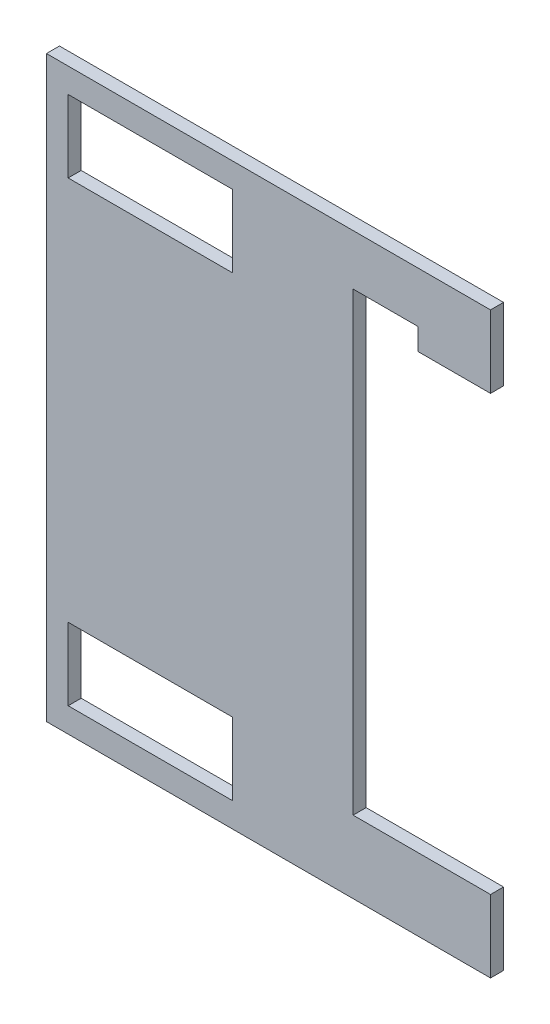
ISO-10303-21;
HEADER;
FILE_DESCRIPTION(('STEP AP214'),'2;1');
FILE_NAME('part.step','',(''),(''),'','','');
FILE_SCHEMA(('AUTOMOTIVE_DESIGN { 1 0 10303 214 1 1 1 1 }'));
ENDSEC;
DATA;
#1=APPLICATION_CONTEXT('core data for automotive mechanical design processes');
#2=APPLICATION_PROTOCOL_DEFINITION('international standard','automotive_design',2000,#1);
#3=PRODUCT_CONTEXT('',#1,'mechanical');
#4=PRODUCT('Part','Part','',(#3));
#5=PRODUCT_RELATED_PRODUCT_CATEGORY('part','',(#4));
#6=PRODUCT_DEFINITION_FORMATION('','',#4);
#7=PRODUCT_DEFINITION_CONTEXT('part definition',#1,'design');
#8=PRODUCT_DEFINITION('design','',#6,#7);
#9=PRODUCT_DEFINITION_SHAPE('','',#8);
#10=(LENGTH_UNIT() NAMED_UNIT(*) SI_UNIT(.MILLI.,.METRE.));
#11=(NAMED_UNIT(*) PLANE_ANGLE_UNIT() SI_UNIT($,.RADIAN.));
#12=(NAMED_UNIT(*) SI_UNIT($,.STERADIAN.) SOLID_ANGLE_UNIT());
#13=UNCERTAINTY_MEASURE_WITH_UNIT(LENGTH_MEASURE(1.E-05),#10,'distance_accuracy_value','');
#14=(GEOMETRIC_REPRESENTATION_CONTEXT(3) GLOBAL_UNCERTAINTY_ASSIGNED_CONTEXT((#13)) GLOBAL_UNIT_ASSIGNED_CONTEXT((#10,
#11,#12)) REPRESENTATION_CONTEXT('',''));
#15=CARTESIAN_POINT('',(0.,0.,0.));
#16=DIRECTION('',(0.,0.,1.));
#17=DIRECTION('',(1.,0.,0.));
#18=AXIS2_PLACEMENT_3D('',#15,#16,#17);
#19=CARTESIAN_POINT('',(0.,0.,9.));
#20=DIRECTION('',(0.,0.,1.));
#21=DIRECTION('',(1.,0.,0.));
#22=AXIS2_PLACEMENT_3D('',#19,#20,#21);
#23=PLANE('',#22);
#24=DIRECTION('',(0.,1.,0.));
#25=VECTOR('',#24,1.);
#26=CARTESIAN_POINT('',(-111.812949640288,0.,9.));
#27=LINE('',#26,#25);
#28=CARTESIAN_POINT('',(-111.812949640288,-24.6,9.));
#29=VERTEX_POINT('',#28);
#30=CARTESIAN_POINT('',(-111.812949640288,290.4,9.));
#31=VERTEX_POINT('',#30);
#32=EDGE_CURVE('E196',#29,#31,#27,.T.);
#33=ORIENTED_EDGE('',*,*,#32,.T.);
#34=DIRECTION('',(-1.,0.,0.));
#35=VECTOR('',#34,1.);
#36=CARTESIAN_POINT('',(0.,290.4,9.));
#37=LINE('',#36,#35);
#38=CARTESIAN_POINT('',(-66.8129496402878,290.4,9.));
#39=VERTEX_POINT('',#38);
#40=EDGE_CURVE('E179',#39,#31,#37,.T.);
#41=ORIENTED_EDGE('',*,*,#40,.F.);
#42=DIRECTION('',(0.,1.,0.));
#43=VECTOR('',#42,1.);
#44=CARTESIAN_POINT('',(-66.8129496402878,0.,9.));
#45=LINE('',#44,#43);
#46=CARTESIAN_POINT('',(-66.8129496402878,275.4,9.));
#47=VERTEX_POINT('',#46);
#48=EDGE_CURVE('E191',#47,#39,#45,.T.);
#49=ORIENTED_EDGE('',*,*,#48,.F.);
#50=DIRECTION('',(-1.,0.,0.));
#51=VECTOR('',#50,1.);
#52=CARTESIAN_POINT('',(0.,275.4,9.));
#53=LINE('',#52,#51);
#54=CARTESIAN_POINT('',(-16.8129496402878,275.4,9.));
#55=VERTEX_POINT('',#54);
#56=EDGE_CURVE('E198',#55,#47,#53,.T.);
#57=ORIENTED_EDGE('',*,*,#56,.F.);
#58=DIRECTION('',(0.,1.,0.));
#59=VECTOR('',#58,1.);
#60=CARTESIAN_POINT('',(-16.8129496402878,-74.6,9.));
#61=LINE('',#60,#59);
#62=CARTESIAN_POINT('',(-16.8129496402878,325.4,9.));
#63=VERTEX_POINT('',#62);
#64=EDGE_CURVE('E273',#55,#63,#61,.T.);
#65=ORIENTED_EDGE('',*,*,#64,.T.);
#66=DIRECTION('',(-1.,0.,0.));
#67=VECTOR('',#66,1.);
#68=CARTESIAN_POINT('',(-16.8129496402878,325.4,9.));
#69=LINE('',#68,#67);
#70=CARTESIAN_POINT('',(-323.812158171947,325.4,9.));
#71=VERTEX_POINT('',#70);
#72=EDGE_CURVE('E278',#63,#71,#69,.T.);
#73=ORIENTED_EDGE('',*,*,#72,.T.);
#74=DIRECTION('',(0.,-1.,0.));
#75=VECTOR('',#74,1.);
#76=CARTESIAN_POINT('',(-323.812158171947,325.4,9.));
#77=LINE('',#76,#75);
#78=CARTESIAN_POINT('',(-323.812158171947,-74.6,9.));
#79=VERTEX_POINT('',#78);
#80=EDGE_CURVE('E280',#71,#79,#77,.T.);
#81=ORIENTED_EDGE('',*,*,#80,.T.);
#82=DIRECTION('',(1.,0.,0.));
#83=VECTOR('',#82,1.);
#84=CARTESIAN_POINT('',(-323.812158171947,-74.6,9.));
#85=LINE('',#84,#83);
#86=CARTESIAN_POINT('',(-16.8129496402878,-74.6,9.));
#87=VERTEX_POINT('',#86);
#88=EDGE_CURVE('E270',#79,#87,#85,.T.);
#89=ORIENTED_EDGE('',*,*,#88,.T.);
#90=CARTESIAN_POINT('',(-16.8129496402878,-24.6,9.));
#91=VERTEX_POINT('',#90);
#92=EDGE_CURVE('E275',#87,#91,#61,.T.);
#93=ORIENTED_EDGE('',*,*,#92,.T.);
#94=DIRECTION('',(-1.,0.,0.));
#95=VECTOR('',#94,1.);
#96=CARTESIAN_POINT('',(0.,-24.6,9.));
#97=LINE('',#96,#95);
#98=EDGE_CURVE('E48',#91,#29,#97,.T.);
#99=ORIENTED_EDGE('',*,*,#98,.T.);
#100=EDGE_LOOP('',(#33,#41,#49,#57,#65,#73,#81,#89,#93,#99));
#101=FACE_BOUND('',#100,.T.);
#102=DIRECTION('',(1.,0.,0.));
#103=VECTOR('',#102,1.);
#104=CARTESIAN_POINT('',(-308.812158171947,258.4,9.));
#105=LINE('',#104,#103);
#106=CARTESIAN_POINT('',(-308.812158171947,258.4,9.));
#107=VERTEX_POINT('',#106);
#108=CARTESIAN_POINT('',(-195.172949640288,258.4,9.));
#109=VERTEX_POINT('',#108);
#110=EDGE_CURVE('E241',#107,#109,#105,.T.);
#111=ORIENTED_EDGE('',*,*,#110,.F.);
#112=DIRECTION('',(0.,-1.,0.));
#113=VECTOR('',#112,1.);
#114=CARTESIAN_POINT('',(-308.812158171947,308.4,9.));
#115=LINE('',#114,#113);
#116=CARTESIAN_POINT('',(-308.812158171947,308.4,9.));
#117=VERTEX_POINT('',#116);
#118=EDGE_CURVE('E239',#117,#107,#115,.T.);
#119=ORIENTED_EDGE('',*,*,#118,.F.);
#120=DIRECTION('',(-1.,0.,0.));
#121=VECTOR('',#120,1.);
#122=CARTESIAN_POINT('',(-308.812158171947,308.4,9.));
#123=LINE('',#122,#121);
#124=CARTESIAN_POINT('',(-195.172949640288,308.4,9.));
#125=VERTEX_POINT('',#124);
#126=EDGE_CURVE('E247',#125,#117,#123,.T.);
#127=ORIENTED_EDGE('',*,*,#126,.F.);
#128=DIRECTION('',(0.,1.,0.));
#129=VECTOR('',#128,1.);
#130=CARTESIAN_POINT('',(-195.172949640288,308.4,9.));
#131=LINE('',#130,#129);
#132=EDGE_CURVE('E244',#109,#125,#131,.T.);
#133=ORIENTED_EDGE('',*,*,#132,.F.);
#134=EDGE_LOOP('',(#111,#119,#127,#133));
#135=FACE_BOUND('',#134,.T.);
#136=DIRECTION('',(1.,0.,0.));
#137=VECTOR('',#136,1.);
#138=CARTESIAN_POINT('',(-308.812158171947,-57.6,9.));
#139=LINE('',#138,#137);
#140=CARTESIAN_POINT('',(-308.812158171947,-57.6,9.));
#141=VERTEX_POINT('',#140);
#142=CARTESIAN_POINT('',(-195.172949640288,-57.6,9.));
#143=VERTEX_POINT('',#142);
#144=EDGE_CURVE('E212',#141,#143,#139,.T.);
#145=ORIENTED_EDGE('',*,*,#144,.F.);
#146=DIRECTION('',(0.,-1.,0.));
#147=VECTOR('',#146,1.);
#148=CARTESIAN_POINT('',(-308.812158171947,-57.6,9.));
#149=LINE('',#148,#147);
#150=CARTESIAN_POINT('',(-308.812158171947,-7.60000000000006,9.));
#151=VERTEX_POINT('',#150);
#152=EDGE_CURVE('E210',#151,#141,#149,.T.);
#153=ORIENTED_EDGE('',*,*,#152,.F.);
#154=DIRECTION('',(-1.,0.,0.));
#155=VECTOR('',#154,1.);
#156=CARTESIAN_POINT('',(-308.812158171947,-7.60000000000006,9.));
#157=LINE('',#156,#155);
#158=CARTESIAN_POINT('',(-195.172949640288,-7.60000000000007,9.));
#159=VERTEX_POINT('',#158);
#160=EDGE_CURVE('E217',#159,#151,#157,.T.);
#161=ORIENTED_EDGE('',*,*,#160,.F.);
#162=DIRECTION('',(0.,1.,0.));
#163=VECTOR('',#162,1.);
#164=CARTESIAN_POINT('',(-195.172949640288,-57.6,9.));
#165=LINE('',#164,#163);
#166=EDGE_CURVE('E215',#143,#159,#165,.T.);
#167=ORIENTED_EDGE('',*,*,#166,.F.);
#168=EDGE_LOOP('',(#145,#153,#161,#167));
#169=FACE_BOUND('',#168,.T.);
#170=ADVANCED_FACE('F33',(#101,#135,#169),#23,.T.);
#171=CARTESIAN_POINT('',(0.,0.,0.));
#172=DIRECTION('',(0.,0.,1.));
#173=DIRECTION('',(1.,0.,0.));
#174=AXIS2_PLACEMENT_3D('',#171,#172,#173);
#175=PLANE('',#174);
#176=DIRECTION('',(0.,-1.,0.));
#177=VECTOR('',#176,1.);
#178=CARTESIAN_POINT('',(-308.812158171947,-57.6,0.));
#179=LINE('',#178,#177);
#180=CARTESIAN_POINT('',(-308.812158171947,-7.60000000000006,0.));
#181=VERTEX_POINT('',#180);
#182=CARTESIAN_POINT('',(-308.812158171947,-57.6,0.));
#183=VERTEX_POINT('',#182);
#184=EDGE_CURVE('E207',#181,#183,#179,.T.);
#185=ORIENTED_EDGE('',*,*,#184,.T.);
#186=DIRECTION('',(1.,0.,0.));
#187=VECTOR('',#186,1.);
#188=CARTESIAN_POINT('',(-308.812158171947,-57.6,0.));
#189=LINE('',#188,#187);
#190=CARTESIAN_POINT('',(-195.172949640288,-57.6,0.));
#191=VERTEX_POINT('',#190);
#192=EDGE_CURVE('E222',#183,#191,#189,.T.);
#193=ORIENTED_EDGE('',*,*,#192,.T.);
#194=DIRECTION('',(0.,1.,0.));
#195=VECTOR('',#194,1.);
#196=CARTESIAN_POINT('',(-195.172949640288,-57.6,0.));
#197=LINE('',#196,#195);
#198=CARTESIAN_POINT('',(-195.172949640288,-7.60000000000007,0.));
#199=VERTEX_POINT('',#198);
#200=EDGE_CURVE('E225',#191,#199,#197,.T.);
#201=ORIENTED_EDGE('',*,*,#200,.T.);
#202=DIRECTION('',(-1.,0.,0.));
#203=VECTOR('',#202,1.);
#204=CARTESIAN_POINT('',(-308.812158171947,-7.60000000000006,0.));
#205=LINE('',#204,#203);
#206=EDGE_CURVE('E213',#199,#181,#205,.T.);
#207=ORIENTED_EDGE('',*,*,#206,.T.);
#208=EDGE_LOOP('',(#185,#193,#201,#207));
#209=FACE_BOUND('',#208,.T.);
#210=DIRECTION('',(0.,-1.,0.));
#211=VECTOR('',#210,1.);
#212=CARTESIAN_POINT('',(-308.812158171947,308.4,0.));
#213=LINE('',#212,#211);
#214=CARTESIAN_POINT('',(-308.812158171947,308.4,0.));
#215=VERTEX_POINT('',#214);
#216=CARTESIAN_POINT('',(-308.812158171947,258.4,0.));
#217=VERTEX_POINT('',#216);
#218=EDGE_CURVE('E238',#215,#217,#213,.T.);
#219=ORIENTED_EDGE('',*,*,#218,.T.);
#220=DIRECTION('',(1.,0.,0.));
#221=VECTOR('',#220,1.);
#222=CARTESIAN_POINT('',(-308.812158171947,258.4,0.));
#223=LINE('',#222,#221);
#224=CARTESIAN_POINT('',(-195.172949640288,258.4,0.));
#225=VERTEX_POINT('',#224);
#226=EDGE_CURVE('E252',#217,#225,#223,.T.);
#227=ORIENTED_EDGE('',*,*,#226,.T.);
#228=DIRECTION('',(0.,1.,0.));
#229=VECTOR('',#228,1.);
#230=CARTESIAN_POINT('',(-195.172949640288,308.4,0.));
#231=LINE('',#230,#229);
#232=CARTESIAN_POINT('',(-195.172949640288,308.4,0.));
#233=VERTEX_POINT('',#232);
#234=EDGE_CURVE('E255',#225,#233,#231,.T.);
#235=ORIENTED_EDGE('',*,*,#234,.T.);
#236=DIRECTION('',(-1.,0.,0.));
#237=VECTOR('',#236,1.);
#238=CARTESIAN_POINT('',(-308.812158171947,308.4,0.));
#239=LINE('',#238,#237);
#240=EDGE_CURVE('E242',#233,#215,#239,.T.);
#241=ORIENTED_EDGE('',*,*,#240,.T.);
#242=EDGE_LOOP('',(#219,#227,#235,#241));
#243=FACE_BOUND('',#242,.T.);
#244=DIRECTION('',(1.,0.,0.));
#245=VECTOR('',#244,1.);
#246=CARTESIAN_POINT('',(-111.812949640288,290.4,0.));
#247=LINE('',#246,#245);
#248=CARTESIAN_POINT('',(-111.812949640288,290.4,0.));
#249=VERTEX_POINT('',#248);
#250=CARTESIAN_POINT('',(-66.8129496402878,290.4,0.));
#251=VERTEX_POINT('',#250);
#252=EDGE_CURVE('E176',#249,#251,#247,.T.);
#253=ORIENTED_EDGE('',*,*,#252,.F.);
#254=DIRECTION('',(0.,1.,0.));
#255=VECTOR('',#254,1.);
#256=CARTESIAN_POINT('',(-111.812949640288,0.,0.));
#257=LINE('',#256,#255);
#258=CARTESIAN_POINT('',(-111.812949640288,-24.6,0.));
#259=VERTEX_POINT('',#258);
#260=EDGE_CURVE('E158',#259,#249,#257,.T.);
#261=ORIENTED_EDGE('',*,*,#260,.F.);
#262=DIRECTION('',(-1.,0.,0.));
#263=VECTOR('',#262,1.);
#264=CARTESIAN_POINT('',(0.,-24.6,0.));
#265=LINE('',#264,#263);
#266=CARTESIAN_POINT('',(-16.8129496402878,-24.6,0.));
#267=VERTEX_POINT('',#266);
#268=EDGE_CURVE('E169',#267,#259,#265,.T.);
#269=ORIENTED_EDGE('',*,*,#268,.F.);
#270=DIRECTION('',(0.,1.,0.));
#271=VECTOR('',#270,1.);
#272=CARTESIAN_POINT('',(-16.8129496402878,-74.6,0.));
#273=LINE('',#272,#271);
#274=CARTESIAN_POINT('',(-16.8129496402878,-74.6,0.));
#275=VERTEX_POINT('',#274);
#276=EDGE_CURVE('E286',#275,#267,#273,.T.);
#277=ORIENTED_EDGE('',*,*,#276,.F.);
#278=DIRECTION('',(1.,0.,0.));
#279=VECTOR('',#278,1.);
#280=CARTESIAN_POINT('',(-323.812158171947,-74.6,0.));
#281=LINE('',#280,#279);
#282=CARTESIAN_POINT('',(-323.812158171947,-74.6,0.));
#283=VERTEX_POINT('',#282);
#284=EDGE_CURVE('E269',#283,#275,#281,.T.);
#285=ORIENTED_EDGE('',*,*,#284,.F.);
#286=DIRECTION('',(0.,-1.,0.));
#287=VECTOR('',#286,1.);
#288=CARTESIAN_POINT('',(-323.812158171947,325.4,0.));
#289=LINE('',#288,#287);
#290=CARTESIAN_POINT('',(-323.812158171947,325.4,0.));
#291=VERTEX_POINT('',#290);
#292=EDGE_CURVE('E274',#291,#283,#289,.T.);
#293=ORIENTED_EDGE('',*,*,#292,.F.);
#294=DIRECTION('',(-1.,0.,0.));
#295=VECTOR('',#294,1.);
#296=CARTESIAN_POINT('',(-16.8129496402878,325.4,0.));
#297=LINE('',#296,#295);
#298=CARTESIAN_POINT('',(-16.8129496402878,325.4,0.));
#299=VERTEX_POINT('',#298);
#300=EDGE_CURVE('E289',#299,#291,#297,.T.);
#301=ORIENTED_EDGE('',*,*,#300,.F.);
#302=CARTESIAN_POINT('',(-16.8129496402878,275.4,0.));
#303=VERTEX_POINT('',#302);
#304=EDGE_CURVE('E285',#303,#299,#273,.T.);
#305=ORIENTED_EDGE('',*,*,#304,.F.);
#306=DIRECTION('',(-1.,0.,0.));
#307=VECTOR('',#306,1.);
#308=CARTESIAN_POINT('',(0.,275.4,0.));
#309=LINE('',#308,#307);
#310=CARTESIAN_POINT('',(-66.8129496402878,275.4,0.));
#311=VERTEX_POINT('',#310);
#312=EDGE_CURVE('E168',#303,#311,#309,.T.);
#313=ORIENTED_EDGE('',*,*,#312,.T.);
#314=DIRECTION('',(0.,-1.,0.));
#315=VECTOR('',#314,1.);
#316=CARTESIAN_POINT('',(-66.8129496402878,275.4,0.));
#317=LINE('',#316,#315);
#318=EDGE_CURVE('E181',#251,#311,#317,.T.);
#319=ORIENTED_EDGE('',*,*,#318,.F.);
#320=EDGE_LOOP('',(#253,#261,#269,#277,#285,#293,#301,#305,#313,#319));
#321=FACE_BOUND('',#320,.T.);
#322=ADVANCED_FACE('F183',(#209,#243,#321),#175,.F.);
#323=CARTESIAN_POINT('',(-16.8129496402878,-74.6,9.));
#324=DIRECTION('',(-1.,0.,0.));
#325=DIRECTION('',(0.,-1.,0.));
#326=AXIS2_PLACEMENT_3D('',#323,#324,#325);
#327=PLANE('',#326);
#328=DIRECTION('',(0.,0.,-1.));
#329=VECTOR('',#328,1.);
#330=CARTESIAN_POINT('',(-16.8129496402878,275.4,9.));
#331=LINE('',#330,#329);
#332=EDGE_CURVE('E204',#55,#303,#331,.T.);
#333=ORIENTED_EDGE('',*,*,#332,.T.);
#334=ORIENTED_EDGE('',*,*,#304,.T.);
#335=DIRECTION('',(0.,0.,-1.));
#336=VECTOR('',#335,1.);
#337=CARTESIAN_POINT('',(-16.8129496402878,325.4,9.));
#338=LINE('',#337,#336);
#339=EDGE_CURVE('E41',#63,#299,#338,.T.);
#340=ORIENTED_EDGE('',*,*,#339,.F.);
#341=ORIENTED_EDGE('',*,*,#64,.F.);
#342=EDGE_LOOP('',(#333,#334,#340,#341));
#343=FACE_BOUND('',#342,.T.);
#344=ADVANCED_FACE('F319',(#343),#327,.F.);
#345=CARTESIAN_POINT('',(-323.812158171947,-74.6,9.));
#346=DIRECTION('',(0.,1.,0.));
#347=DIRECTION('',(0.,0.,1.));
#348=AXIS2_PLACEMENT_3D('',#345,#346,#347);
#349=PLANE('',#348);
#350=ORIENTED_EDGE('',*,*,#284,.T.);
#351=DIRECTION('',(0.,0.,-1.));
#352=VECTOR('',#351,1.);
#353=CARTESIAN_POINT('',(-16.8129496402878,-74.6,9.));
#354=LINE('',#353,#352);
#355=EDGE_CURVE('E11',#87,#275,#354,.T.);
#356=ORIENTED_EDGE('',*,*,#355,.F.);
#357=ORIENTED_EDGE('',*,*,#88,.F.);
#358=DIRECTION('',(0.,0.,-1.));
#359=VECTOR('',#358,1.);
#360=CARTESIAN_POINT('',(-323.812158171947,-74.6,9.));
#361=LINE('',#360,#359);
#362=EDGE_CURVE('E282',#79,#283,#361,.T.);
#363=ORIENTED_EDGE('',*,*,#362,.T.);
#364=EDGE_LOOP('',(#350,#356,#357,#363));
#365=FACE_BOUND('',#364,.T.);
#366=ADVANCED_FACE('F35',(#365),#349,.F.);
#367=ORIENTED_EDGE('',*,*,#276,.T.);
#368=DIRECTION('',(0.,0.,-1.));
#369=VECTOR('',#368,1.);
#370=CARTESIAN_POINT('',(-16.8129496402878,-24.6,9.));
#371=LINE('',#370,#369);
#372=EDGE_CURVE('E201',#91,#267,#371,.T.);
#373=ORIENTED_EDGE('',*,*,#372,.F.);
#374=ORIENTED_EDGE('',*,*,#92,.F.);
#375=ORIENTED_EDGE('',*,*,#355,.T.);
#376=EDGE_LOOP('',(#367,#373,#374,#375));
#377=FACE_BOUND('',#376,.T.);
#378=ADVANCED_FACE('F349',(#377),#327,.F.);
#379=CARTESIAN_POINT('',(-16.8129496402878,325.4,9.));
#380=DIRECTION('',(0.,-1.,0.));
#381=DIRECTION('',(1.,0.,0.));
#382=AXIS2_PLACEMENT_3D('',#379,#380,#381);
#383=PLANE('',#382);
#384=ORIENTED_EDGE('',*,*,#300,.T.);
#385=DIRECTION('',(0.,0.,-1.));
#386=VECTOR('',#385,1.);
#387=CARTESIAN_POINT('',(-323.812158171947,325.4,9.));
#388=LINE('',#387,#386);
#389=EDGE_CURVE('E294',#71,#291,#388,.T.);
#390=ORIENTED_EDGE('',*,*,#389,.F.);
#391=ORIENTED_EDGE('',*,*,#72,.F.);
#392=ORIENTED_EDGE('',*,*,#339,.T.);
#393=EDGE_LOOP('',(#384,#390,#391,#392));
#394=FACE_BOUND('',#393,.T.);
#395=ADVANCED_FACE('F301',(#394),#383,.F.);
#396=CARTESIAN_POINT('',(-323.812158171947,325.4,9.));
#397=DIRECTION('',(1.,0.,0.));
#398=DIRECTION('',(0.,1.,0.));
#399=AXIS2_PLACEMENT_3D('',#396,#397,#398);
#400=PLANE('',#399);
#401=ORIENTED_EDGE('',*,*,#292,.T.);
#402=ORIENTED_EDGE('',*,*,#362,.F.);
#403=ORIENTED_EDGE('',*,*,#80,.F.);
#404=ORIENTED_EDGE('',*,*,#389,.T.);
#405=EDGE_LOOP('',(#401,#402,#403,#404));
#406=FACE_BOUND('',#405,.T.);
#407=ADVANCED_FACE('F310',(#406),#400,.F.);
#408=CARTESIAN_POINT('',(-308.812158171947,308.4,9.));
#409=DIRECTION('',(1.,0.,0.));
#410=DIRECTION('',(0.,0.,-1.));
#411=AXIS2_PLACEMENT_3D('',#408,#409,#410);
#412=PLANE('',#411);
#413=ORIENTED_EDGE('',*,*,#218,.F.);
#414=DIRECTION('',(0.,0.,-1.));
#415=VECTOR('',#414,1.);
#416=CARTESIAN_POINT('',(-308.812158171947,308.4,9.));
#417=LINE('',#416,#415);
#418=EDGE_CURVE('E249',#117,#215,#417,.T.);
#419=ORIENTED_EDGE('',*,*,#418,.F.);
#420=ORIENTED_EDGE('',*,*,#118,.T.);
#421=DIRECTION('',(0.,0.,-1.));
#422=VECTOR('',#421,1.);
#423=CARTESIAN_POINT('',(-308.812158171947,258.4,9.));
#424=LINE('',#423,#422);
#425=EDGE_CURVE('E266',#107,#217,#424,.T.);
#426=ORIENTED_EDGE('',*,*,#425,.T.);
#427=EDGE_LOOP('',(#413,#419,#420,#426));
#428=FACE_BOUND('',#427,.T.);
#429=ADVANCED_FACE('F343',(#428),#412,.T.);
#430=CARTESIAN_POINT('',(-308.812158171947,258.4,9.));
#431=DIRECTION('',(0.,1.,0.));
#432=DIRECTION('',(0.,0.,1.));
#433=AXIS2_PLACEMENT_3D('',#430,#431,#432);
#434=PLANE('',#433);
#435=ORIENTED_EDGE('',*,*,#226,.F.);
#436=ORIENTED_EDGE('',*,*,#425,.F.);
#437=ORIENTED_EDGE('',*,*,#110,.T.);
#438=DIRECTION('',(0.,0.,-1.));
#439=VECTOR('',#438,1.);
#440=CARTESIAN_POINT('',(-195.172949640288,258.4,9.));
#441=LINE('',#440,#439);
#442=EDGE_CURVE('E264',#109,#225,#441,.T.);
#443=ORIENTED_EDGE('',*,*,#442,.T.);
#444=EDGE_LOOP('',(#435,#436,#437,#443));
#445=FACE_BOUND('',#444,.T.);
#446=ADVANCED_FACE('F388',(#445),#434,.T.);
#447=CARTESIAN_POINT('',(-195.172949640288,308.4,9.));
#448=DIRECTION('',(-1.,0.,0.));
#449=DIRECTION('',(0.,0.,1.));
#450=AXIS2_PLACEMENT_3D('',#447,#448,#449);
#451=PLANE('',#450);
#452=ORIENTED_EDGE('',*,*,#234,.F.);
#453=ORIENTED_EDGE('',*,*,#442,.F.);
#454=ORIENTED_EDGE('',*,*,#132,.T.);
#455=DIRECTION('',(0.,0.,-1.));
#456=VECTOR('',#455,1.);
#457=CARTESIAN_POINT('',(-195.172949640288,308.4,9.));
#458=LINE('',#457,#456);
#459=EDGE_CURVE('E262',#125,#233,#458,.T.);
#460=ORIENTED_EDGE('',*,*,#459,.T.);
#461=EDGE_LOOP('',(#452,#453,#454,#460));
#462=FACE_BOUND('',#461,.T.);
#463=ADVANCED_FACE('F397',(#462),#451,.T.);
#464=CARTESIAN_POINT('',(-308.812158171947,308.4,9.));
#465=DIRECTION('',(0.,-1.,0.));
#466=DIRECTION('',(0.,0.,-1.));
#467=AXIS2_PLACEMENT_3D('',#464,#465,#466);
#468=PLANE('',#467);
#469=ORIENTED_EDGE('',*,*,#240,.F.);
#470=ORIENTED_EDGE('',*,*,#459,.F.);
#471=ORIENTED_EDGE('',*,*,#126,.T.);
#472=ORIENTED_EDGE('',*,*,#418,.T.);
#473=EDGE_LOOP('',(#469,#470,#471,#472));
#474=FACE_BOUND('',#473,.T.);
#475=ADVANCED_FACE('F406',(#474),#468,.T.);
#476=CARTESIAN_POINT('',(-308.812158171947,-57.6,9.));
#477=DIRECTION('',(1.,0.,0.));
#478=DIRECTION('',(0.,0.,-1.));
#479=AXIS2_PLACEMENT_3D('',#476,#477,#478);
#480=PLANE('',#479);
#481=ORIENTED_EDGE('',*,*,#184,.F.);
#482=DIRECTION('',(0.,0.,-1.));
#483=VECTOR('',#482,1.);
#484=CARTESIAN_POINT('',(-308.812158171947,-7.60000000000006,9.));
#485=LINE('',#484,#483);
#486=EDGE_CURVE('E219',#151,#181,#485,.T.);
#487=ORIENTED_EDGE('',*,*,#486,.F.);
#488=ORIENTED_EDGE('',*,*,#152,.T.);
#489=DIRECTION('',(0.,0.,-1.));
#490=VECTOR('',#489,1.);
#491=CARTESIAN_POINT('',(-308.812158171947,-57.6,9.));
#492=LINE('',#491,#490);
#493=EDGE_CURVE('E235',#141,#183,#492,.T.);
#494=ORIENTED_EDGE('',*,*,#493,.T.);
#495=EDGE_LOOP('',(#481,#487,#488,#494));
#496=FACE_BOUND('',#495,.T.);
#497=ADVANCED_FACE('F416',(#496),#480,.T.);
#498=CARTESIAN_POINT('',(-308.812158171947,-57.6,9.));
#499=DIRECTION('',(0.,1.,0.));
#500=DIRECTION('',(0.,0.,1.));
#501=AXIS2_PLACEMENT_3D('',#498,#499,#500);
#502=PLANE('',#501);
#503=ORIENTED_EDGE('',*,*,#192,.F.);
#504=ORIENTED_EDGE('',*,*,#493,.F.);
#505=ORIENTED_EDGE('',*,*,#144,.T.);
#506=DIRECTION('',(0.,0.,-1.));
#507=VECTOR('',#506,1.);
#508=CARTESIAN_POINT('',(-195.172949640288,-57.6,9.));
#509=LINE('',#508,#507);
#510=EDGE_CURVE('E233',#143,#191,#509,.T.);
#511=ORIENTED_EDGE('',*,*,#510,.T.);
#512=EDGE_LOOP('',(#503,#504,#505,#511));
#513=FACE_BOUND('',#512,.T.);
#514=ADVANCED_FACE('F426',(#513),#502,.T.);
#515=CARTESIAN_POINT('',(-195.172949640288,-57.6,9.));
#516=DIRECTION('',(-1.,0.,0.));
#517=DIRECTION('',(0.,0.,1.));
#518=AXIS2_PLACEMENT_3D('',#515,#516,#517);
#519=PLANE('',#518);
#520=ORIENTED_EDGE('',*,*,#200,.F.);
#521=ORIENTED_EDGE('',*,*,#510,.F.);
#522=ORIENTED_EDGE('',*,*,#166,.T.);
#523=DIRECTION('',(0.,0.,-1.));
#524=VECTOR('',#523,1.);
#525=CARTESIAN_POINT('',(-195.172949640288,-7.60000000000007,9.));
#526=LINE('',#525,#524);
#527=EDGE_CURVE('E56',#159,#199,#526,.T.);
#528=ORIENTED_EDGE('',*,*,#527,.T.);
#529=EDGE_LOOP('',(#520,#521,#522,#528));
#530=FACE_BOUND('',#529,.T.);
#531=ADVANCED_FACE('F436',(#530),#519,.T.);
#532=CARTESIAN_POINT('',(-308.812158171947,-7.60000000000006,9.));
#533=DIRECTION('',(0.,-1.,0.));
#534=DIRECTION('',(1.,0.,0.));
#535=AXIS2_PLACEMENT_3D('',#532,#533,#534);
#536=PLANE('',#535);
#537=ORIENTED_EDGE('',*,*,#206,.F.);
#538=ORIENTED_EDGE('',*,*,#527,.F.);
#539=ORIENTED_EDGE('',*,*,#160,.T.);
#540=ORIENTED_EDGE('',*,*,#486,.T.);
#541=EDGE_LOOP('',(#537,#538,#539,#540));
#542=FACE_BOUND('',#541,.T.);
#543=ADVANCED_FACE('F445',(#542),#536,.T.);
#544=CARTESIAN_POINT('',(0.,275.4,9.));
#545=DIRECTION('',(0.,-1.,0.));
#546=DIRECTION('',(0.,0.,-1.));
#547=AXIS2_PLACEMENT_3D('',#544,#545,#546);
#548=PLANE('',#547);
#549=DIRECTION('',(0.,0.,-1.));
#550=VECTOR('',#549,1.);
#551=CARTESIAN_POINT('',(-66.8129496402878,275.4,10.));
#552=LINE('',#551,#550);
#553=EDGE_CURVE('E188',#47,#311,#552,.T.);
#554=ORIENTED_EDGE('',*,*,#553,.T.);
#555=ORIENTED_EDGE('',*,*,#312,.F.);
#556=ORIENTED_EDGE('',*,*,#332,.F.);
#557=ORIENTED_EDGE('',*,*,#56,.T.);
#558=EDGE_LOOP('',(#554,#555,#556,#557));
#559=FACE_BOUND('',#558,.T.);
#560=ADVANCED_FACE('F321',(#559),#548,.T.);
#561=CARTESIAN_POINT('',(-111.812949640288,0.,9.));
#562=DIRECTION('',(-1.,0.,0.));
#563=DIRECTION('',(0.,0.,1.));
#564=AXIS2_PLACEMENT_3D('',#561,#562,#563);
#565=PLANE('',#564);
#566=ORIENTED_EDGE('',*,*,#260,.T.);
#567=DIRECTION('',(0.,0.,-1.));
#568=VECTOR('',#567,1.);
#569=CARTESIAN_POINT('',(-111.812949640288,290.4,10.));
#570=LINE('',#569,#568);
#571=EDGE_CURVE('E162',#31,#249,#570,.T.);
#572=ORIENTED_EDGE('',*,*,#571,.F.);
#573=ORIENTED_EDGE('',*,*,#32,.F.);
#574=DIRECTION('',(0.,0.,-1.));
#575=VECTOR('',#574,1.);
#576=CARTESIAN_POINT('',(-111.812949640288,-24.6,9.));
#577=LINE('',#576,#575);
#578=EDGE_CURVE('E163',#29,#259,#577,.T.);
#579=ORIENTED_EDGE('',*,*,#578,.T.);
#580=EDGE_LOOP('',(#566,#572,#573,#579));
#581=FACE_BOUND('',#580,.T.);
#582=ADVANCED_FACE('F160',(#581),#565,.F.);
#583=CARTESIAN_POINT('',(0.,-24.6,9.));
#584=DIRECTION('',(0.,-1.,0.));
#585=DIRECTION('',(0.,0.,-1.));
#586=AXIS2_PLACEMENT_3D('',#583,#584,#585);
#587=PLANE('',#586);
#588=ORIENTED_EDGE('',*,*,#268,.T.);
#589=ORIENTED_EDGE('',*,*,#578,.F.);
#590=ORIENTED_EDGE('',*,*,#98,.F.);
#591=ORIENTED_EDGE('',*,*,#372,.T.);
#592=EDGE_LOOP('',(#588,#589,#590,#591));
#593=FACE_BOUND('',#592,.T.);
#594=ADVANCED_FACE('F325',(#593),#587,.F.);
#595=CARTESIAN_POINT('',(-66.8129496402878,275.4,10.));
#596=DIRECTION('',(1.,0.,0.));
#597=DIRECTION('',(0.,0.,-1.));
#598=AXIS2_PLACEMENT_3D('',#595,#596,#597);
#599=PLANE('',#598);
#600=ORIENTED_EDGE('',*,*,#48,.T.);
#601=DIRECTION('',(0.,0.,-1.));
#602=VECTOR('',#601,1.);
#603=CARTESIAN_POINT('',(-66.8129496402878,290.4,10.));
#604=LINE('',#603,#602);
#605=EDGE_CURVE('E180',#39,#251,#604,.T.);
#606=ORIENTED_EDGE('',*,*,#605,.T.);
#607=ORIENTED_EDGE('',*,*,#318,.T.);
#608=ORIENTED_EDGE('',*,*,#553,.F.);
#609=EDGE_LOOP('',(#600,#606,#607,#608));
#610=FACE_BOUND('',#609,.T.);
#611=ADVANCED_FACE('F323',(#610),#599,.F.);
#612=CARTESIAN_POINT('',(-111.812949640288,290.4,10.));
#613=DIRECTION('',(0.,1.,0.));
#614=DIRECTION('',(0.,0.,1.));
#615=AXIS2_PLACEMENT_3D('',#612,#613,#614);
#616=PLANE('',#615);
#617=ORIENTED_EDGE('',*,*,#40,.T.);
#618=ORIENTED_EDGE('',*,*,#571,.T.);
#619=ORIENTED_EDGE('',*,*,#252,.T.);
#620=ORIENTED_EDGE('',*,*,#605,.F.);
#621=EDGE_LOOP('',(#617,#618,#619,#620));
#622=FACE_BOUND('',#621,.T.);
#623=ADVANCED_FACE('F174',(#622),#616,.F.);
#624=CLOSED_SHELL('',(#170,#322,#344,#366,#378,#395,#407,#429,#446,#463,#475,#497,#514,#531,
#543,#560,#582,#594,#611,#623));
#625=MANIFOLD_SOLID_BREP('B2',#624);
#626=ADVANCED_BREP_SHAPE_REPRESENTATION('',(#18,#625),#14);
#627=SHAPE_DEFINITION_REPRESENTATION(#9,#626);
ENDSEC;
END-ISO-10303-21;
